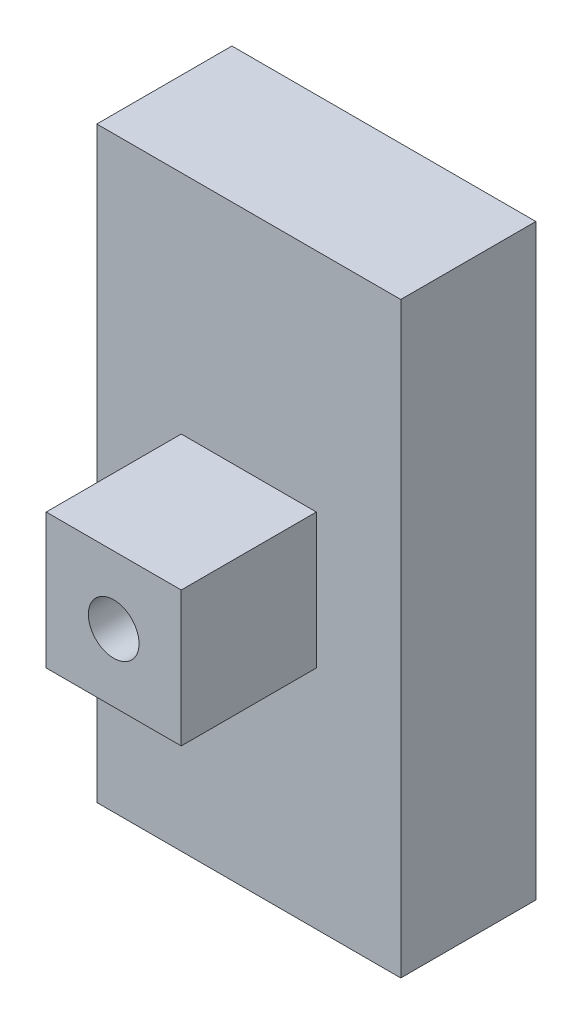
ISO-10303-21;
HEADER;
FILE_DESCRIPTION(('STEP AP214'),'2;1');
FILE_NAME('part.step','',(''),(''),'','','');
FILE_SCHEMA(('AUTOMOTIVE_DESIGN { 1 0 10303 214 1 1 1 1 }'));
ENDSEC;
DATA;
#1=APPLICATION_CONTEXT('core data for automotive mechanical design processes');
#2=APPLICATION_PROTOCOL_DEFINITION('international standard','automotive_design',2000,#1);
#3=PRODUCT_CONTEXT('',#1,'mechanical');
#4=PRODUCT('Part','Part','',(#3));
#5=PRODUCT_RELATED_PRODUCT_CATEGORY('part','',(#4));
#6=PRODUCT_DEFINITION_FORMATION('','',#4);
#7=PRODUCT_DEFINITION_CONTEXT('part definition',#1,'design');
#8=PRODUCT_DEFINITION('design','',#6,#7);
#9=PRODUCT_DEFINITION_SHAPE('','',#8);
#10=(LENGTH_UNIT() NAMED_UNIT(*) SI_UNIT(.MILLI.,.METRE.));
#11=(NAMED_UNIT(*) PLANE_ANGLE_UNIT() SI_UNIT($,.RADIAN.));
#12=(NAMED_UNIT(*) SI_UNIT($,.STERADIAN.) SOLID_ANGLE_UNIT());
#13=UNCERTAINTY_MEASURE_WITH_UNIT(LENGTH_MEASURE(1.E-05),#10,'distance_accuracy_value','');
#14=(GEOMETRIC_REPRESENTATION_CONTEXT(3) GLOBAL_UNCERTAINTY_ASSIGNED_CONTEXT((#13)) GLOBAL_UNIT_ASSIGNED_CONTEXT((#10,
#11,#12)) REPRESENTATION_CONTEXT('',''));
#15=CARTESIAN_POINT('',(0.,0.,0.));
#16=DIRECTION('',(0.,0.,1.));
#17=DIRECTION('',(1.,0.,0.));
#18=AXIS2_PLACEMENT_3D('',#15,#16,#17);
#19=CARTESIAN_POINT('',(-45.0000000000003,86.9999999999998,40.));
#20=DIRECTION('',(0.,-1.,0.));
#21=DIRECTION('',(1.,0.,0.));
#22=AXIS2_PLACEMENT_3D('',#19,#20,#21);
#23=PLANE('',#22);
#24=DIRECTION('',(-1.,0.,0.));
#25=VECTOR('',#24,1.);
#26=CARTESIAN_POINT('',(-45.0000000000003,86.9999999999998,0.));
#27=LINE('',#26,#25);
#28=CARTESIAN_POINT('',(44.9999999999997,87.0000000000001,0.));
#29=VERTEX_POINT('',#28);
#30=CARTESIAN_POINT('',(-45.0000000000003,86.9999999999998,0.));
#31=VERTEX_POINT('',#30);
#32=EDGE_CURVE('E123',#29,#31,#27,.T.);
#33=ORIENTED_EDGE('',*,*,#32,.T.);
#34=DIRECTION('',(0.,0.,-1.));
#35=VECTOR('',#34,1.);
#36=CARTESIAN_POINT('',(-45.0000000000003,86.9999999999998,40.));
#37=LINE('',#36,#35);
#38=CARTESIAN_POINT('',(-45.0000000000003,86.9999999999998,40.));
#39=VERTEX_POINT('',#38);
#40=EDGE_CURVE('E11',#39,#31,#37,.T.);
#41=ORIENTED_EDGE('',*,*,#40,.F.);
#42=DIRECTION('',(-1.,0.,0.));
#43=VECTOR('',#42,1.);
#44=CARTESIAN_POINT('',(-45.0000000000003,86.9999999999998,40.));
#45=LINE('',#44,#43);
#46=CARTESIAN_POINT('',(44.9999999999997,87.0000000000001,40.));
#47=VERTEX_POINT('',#46);
#48=EDGE_CURVE('E132',#47,#39,#45,.T.);
#49=ORIENTED_EDGE('',*,*,#48,.F.);
#50=DIRECTION('',(0.,0.,-1.));
#51=VECTOR('',#50,1.);
#52=CARTESIAN_POINT('',(44.9999999999997,87.0000000000001,40.));
#53=LINE('',#52,#51);
#54=EDGE_CURVE('E141',#47,#29,#53,.T.);
#55=ORIENTED_EDGE('',*,*,#54,.T.);
#56=EDGE_LOOP('',(#33,#41,#49,#55));
#57=FACE_BOUND('',#56,.T.);
#58=ADVANCED_FACE('F39',(#57),#23,.F.);
#59=CARTESIAN_POINT('',(-44.9999999999997,-87.0000000000001,40.));
#60=DIRECTION('',(1.,0.,0.));
#61=DIRECTION('',(0.,1.,0.));
#62=AXIS2_PLACEMENT_3D('',#59,#60,#61);
#63=PLANE('',#62);
#64=DIRECTION('',(0.,-1.,0.));
#65=VECTOR('',#64,1.);
#66=CARTESIAN_POINT('',(-44.9999999999997,-87.0000000000001,0.));
#67=LINE('',#66,#65);
#68=CARTESIAN_POINT('',(-44.9999999999997,-87.0000000000001,0.));
#69=VERTEX_POINT('',#68);
#70=EDGE_CURVE('E126',#31,#69,#67,.T.);
#71=ORIENTED_EDGE('',*,*,#70,.T.);
#72=DIRECTION('',(0.,0.,-1.));
#73=VECTOR('',#72,1.);
#74=CARTESIAN_POINT('',(-44.9999999999997,-87.0000000000001,40.));
#75=LINE('',#74,#73);
#76=CARTESIAN_POINT('',(-44.9999999999997,-87.0000000000001,40.));
#77=VERTEX_POINT('',#76);
#78=EDGE_CURVE('E46',#77,#69,#75,.T.);
#79=ORIENTED_EDGE('',*,*,#78,.F.);
#80=DIRECTION('',(0.,-1.,0.));
#81=VECTOR('',#80,1.);
#82=CARTESIAN_POINT('',(-44.9999999999997,-87.0000000000001,40.));
#83=LINE('',#82,#81);
#84=EDGE_CURVE('E135',#39,#77,#83,.T.);
#85=ORIENTED_EDGE('',*,*,#84,.F.);
#86=ORIENTED_EDGE('',*,*,#40,.T.);
#87=EDGE_LOOP('',(#71,#79,#85,#86));
#88=FACE_BOUND('',#87,.T.);
#89=ADVANCED_FACE('F172',(#88),#63,.F.);
#90=CARTESIAN_POINT('',(-44.9999999999997,-87.0000000000001,40.));
#91=DIRECTION('',(0.,1.,0.));
#92=DIRECTION('',(-1.,0.,0.));
#93=AXIS2_PLACEMENT_3D('',#90,#91,#92);
#94=PLANE('',#93);
#95=DIRECTION('',(1.,0.,0.));
#96=VECTOR('',#95,1.);
#97=CARTESIAN_POINT('',(-44.9999999999997,-87.0000000000001,0.));
#98=LINE('',#97,#96);
#99=CARTESIAN_POINT('',(45.0000000000003,-86.9999999999998,0.));
#100=VERTEX_POINT('',#99);
#101=EDGE_CURVE('E144',#69,#100,#98,.T.);
#102=ORIENTED_EDGE('',*,*,#101,.T.);
#103=DIRECTION('',(0.,0.,-1.));
#104=VECTOR('',#103,1.);
#105=CARTESIAN_POINT('',(45.0000000000003,-86.9999999999998,40.));
#106=LINE('',#105,#104);
#107=CARTESIAN_POINT('',(45.0000000000003,-86.9999999999998,40.));
#108=VERTEX_POINT('',#107);
#109=EDGE_CURVE('E149',#108,#100,#106,.T.);
#110=ORIENTED_EDGE('',*,*,#109,.F.);
#111=DIRECTION('',(1.,0.,0.));
#112=VECTOR('',#111,1.);
#113=CARTESIAN_POINT('',(-44.9999999999997,-87.0000000000001,40.));
#114=LINE('',#113,#112);
#115=EDGE_CURVE('E138',#77,#108,#114,.T.);
#116=ORIENTED_EDGE('',*,*,#115,.F.);
#117=ORIENTED_EDGE('',*,*,#78,.T.);
#118=EDGE_LOOP('',(#102,#110,#116,#117));
#119=FACE_BOUND('',#118,.T.);
#120=ADVANCED_FACE('F156',(#119),#94,.F.);
#121=CARTESIAN_POINT('',(45.0000000000003,-86.9999999999998,40.));
#122=DIRECTION('',(-1.,0.,0.));
#123=DIRECTION('',(0.,-1.,0.));
#124=AXIS2_PLACEMENT_3D('',#121,#122,#123);
#125=PLANE('',#124);
#126=DIRECTION('',(0.,1.,0.));
#127=VECTOR('',#126,1.);
#128=CARTESIAN_POINT('',(45.0000000000003,-86.9999999999998,0.));
#129=LINE('',#128,#127);
#130=EDGE_CURVE('E136',#100,#29,#129,.T.);
#131=ORIENTED_EDGE('',*,*,#130,.T.);
#132=ORIENTED_EDGE('',*,*,#54,.F.);
#133=DIRECTION('',(0.,1.,0.));
#134=VECTOR('',#133,1.);
#135=CARTESIAN_POINT('',(45.0000000000003,-86.9999999999998,40.));
#136=LINE('',#135,#134);
#137=EDGE_CURVE('E140',#108,#47,#136,.T.);
#138=ORIENTED_EDGE('',*,*,#137,.F.);
#139=ORIENTED_EDGE('',*,*,#109,.T.);
#140=EDGE_LOOP('',(#131,#132,#138,#139));
#141=FACE_BOUND('',#140,.T.);
#142=ADVANCED_FACE('F165',(#141),#125,.F.);
#143=CARTESIAN_POINT('',(0.,0.,40.));
#144=DIRECTION('',(0.,0.,1.));
#145=DIRECTION('',(1.,0.,0.));
#146=AXIS2_PLACEMENT_3D('',#143,#144,#145);
#147=PLANE('',#146);
#148=DIRECTION('',(0.,1.,0.));
#149=VECTOR('',#148,1.);
#150=CARTESIAN_POINT('',(20.,20.,40.));
#151=LINE('',#150,#149);
#152=CARTESIAN_POINT('',(20.,-20.,40.));
#153=VERTEX_POINT('',#152);
#154=CARTESIAN_POINT('',(20.,20.,40.));
#155=VERTEX_POINT('',#154);
#156=EDGE_CURVE('E53',#153,#155,#151,.T.);
#157=ORIENTED_EDGE('',*,*,#156,.F.);
#158=DIRECTION('',(1.,0.,0.));
#159=VECTOR('',#158,1.);
#160=CARTESIAN_POINT('',(-20.,-20.,40.));
#161=LINE('',#160,#159);
#162=CARTESIAN_POINT('',(-20.,-20.,40.));
#163=VERTEX_POINT('',#162);
#164=EDGE_CURVE('E57',#163,#153,#161,.T.);
#165=ORIENTED_EDGE('',*,*,#164,.F.);
#166=DIRECTION('',(0.,-1.,0.));
#167=VECTOR('',#166,1.);
#168=CARTESIAN_POINT('',(-20.,20.,40.));
#169=LINE('',#168,#167);
#170=CARTESIAN_POINT('',(-20.,20.,40.));
#171=VERTEX_POINT('',#170);
#172=EDGE_CURVE('E224',#171,#163,#169,.T.);
#173=ORIENTED_EDGE('',*,*,#172,.F.);
#174=DIRECTION('',(-1.,0.,0.));
#175=VECTOR('',#174,1.);
#176=CARTESIAN_POINT('',(-20.,20.,40.));
#177=LINE('',#176,#175);
#178=EDGE_CURVE('E215',#155,#171,#177,.T.);
#179=ORIENTED_EDGE('',*,*,#178,.F.);
#180=EDGE_LOOP('',(#157,#165,#173,#179));
#181=FACE_BOUND('',#180,.T.);
#182=ORIENTED_EDGE('',*,*,#48,.T.);
#183=ORIENTED_EDGE('',*,*,#84,.T.);
#184=ORIENTED_EDGE('',*,*,#115,.T.);
#185=ORIENTED_EDGE('',*,*,#137,.T.);
#186=EDGE_LOOP('',(#182,#183,#184,#185));
#187=FACE_BOUND('',#186,.T.);
#188=ADVANCED_FACE('F171',(#181,#187),#147,.T.);
#189=CARTESIAN_POINT('',(0.,0.,0.));
#190=DIRECTION('',(0.,0.,1.));
#191=DIRECTION('',(1.,0.,0.));
#192=AXIS2_PLACEMENT_3D('',#189,#190,#191);
#193=PLANE('',#192);
#194=ORIENTED_EDGE('',*,*,#32,.F.);
#195=ORIENTED_EDGE('',*,*,#130,.F.);
#196=ORIENTED_EDGE('',*,*,#101,.F.);
#197=ORIENTED_EDGE('',*,*,#70,.F.);
#198=EDGE_LOOP('',(#194,#195,#196,#197));
#199=FACE_BOUND('',#198,.T.);
#200=ADVANCED_FACE('F162',(#199),#193,.F.);
#201=CARTESIAN_POINT('',(20.,20.,80.));
#202=DIRECTION('',(-1.,0.,0.));
#203=DIRECTION('',(0.,-1.,0.));
#204=AXIS2_PLACEMENT_3D('',#201,#202,#203);
#205=PLANE('',#204);
#206=ORIENTED_EDGE('',*,*,#156,.T.);
#207=DIRECTION('',(0.,0.,-1.));
#208=VECTOR('',#207,1.);
#209=CARTESIAN_POINT('',(20.,20.,80.));
#210=LINE('',#209,#208);
#211=CARTESIAN_POINT('',(20.,20.,80.));
#212=VERTEX_POINT('',#211);
#213=EDGE_CURVE('E106',#212,#155,#210,.T.);
#214=ORIENTED_EDGE('',*,*,#213,.F.);
#215=DIRECTION('',(0.,1.,0.));
#216=VECTOR('',#215,1.);
#217=CARTESIAN_POINT('',(20.,20.,80.));
#218=LINE('',#217,#216);
#219=CARTESIAN_POINT('',(20.,-20.,80.));
#220=VERTEX_POINT('',#219);
#221=EDGE_CURVE('E112',#220,#212,#218,.T.);
#222=ORIENTED_EDGE('',*,*,#221,.F.);
#223=DIRECTION('',(0.,0.,-1.));
#224=VECTOR('',#223,1.);
#225=CARTESIAN_POINT('',(20.,-20.,80.));
#226=LINE('',#225,#224);
#227=EDGE_CURVE('E221',#220,#153,#226,.T.);
#228=ORIENTED_EDGE('',*,*,#227,.T.);
#229=EDGE_LOOP('',(#206,#214,#222,#228));
#230=FACE_BOUND('',#229,.T.);
#231=ADVANCED_FACE('F122',(#230),#205,.F.);
#232=CARTESIAN_POINT('',(-20.,20.,80.));
#233=DIRECTION('',(0.,-1.,0.));
#234=DIRECTION('',(0.,0.,-1.));
#235=AXIS2_PLACEMENT_3D('',#232,#233,#234);
#236=PLANE('',#235);
#237=ORIENTED_EDGE('',*,*,#178,.T.);
#238=DIRECTION('',(0.,0.,-1.));
#239=VECTOR('',#238,1.);
#240=CARTESIAN_POINT('',(-20.,20.,80.));
#241=LINE('',#240,#239);
#242=CARTESIAN_POINT('',(-20.,20.,80.));
#243=VERTEX_POINT('',#242);
#244=EDGE_CURVE('E108',#243,#171,#241,.T.);
#245=ORIENTED_EDGE('',*,*,#244,.F.);
#246=DIRECTION('',(-1.,0.,0.));
#247=VECTOR('',#246,1.);
#248=CARTESIAN_POINT('',(-20.,20.,80.));
#249=LINE('',#248,#247);
#250=EDGE_CURVE('E101',#212,#243,#249,.T.);
#251=ORIENTED_EDGE('',*,*,#250,.F.);
#252=ORIENTED_EDGE('',*,*,#213,.T.);
#253=EDGE_LOOP('',(#237,#245,#251,#252));
#254=FACE_BOUND('',#253,.T.);
#255=ADVANCED_FACE('F104',(#254),#236,.F.);
#256=CARTESIAN_POINT('',(-20.,20.,80.));
#257=DIRECTION('',(1.,0.,0.));
#258=DIRECTION('',(0.,1.,0.));
#259=AXIS2_PLACEMENT_3D('',#256,#257,#258);
#260=PLANE('',#259);
#261=ORIENTED_EDGE('',*,*,#172,.T.);
#262=DIRECTION('',(0.,0.,-1.));
#263=VECTOR('',#262,1.);
#264=CARTESIAN_POINT('',(-20.,-20.,80.));
#265=LINE('',#264,#263);
#266=CARTESIAN_POINT('',(-20.,-20.,80.));
#267=VERTEX_POINT('',#266);
#268=EDGE_CURVE('E128',#267,#163,#265,.T.);
#269=ORIENTED_EDGE('',*,*,#268,.F.);
#270=DIRECTION('',(0.,-1.,0.));
#271=VECTOR('',#270,1.);
#272=CARTESIAN_POINT('',(-20.,20.,80.));
#273=LINE('',#272,#271);
#274=EDGE_CURVE('E111',#243,#267,#273,.T.);
#275=ORIENTED_EDGE('',*,*,#274,.F.);
#276=ORIENTED_EDGE('',*,*,#244,.T.);
#277=EDGE_LOOP('',(#261,#269,#275,#276));
#278=FACE_BOUND('',#277,.T.);
#279=ADVANCED_FACE('F190',(#278),#260,.F.);
#280=CARTESIAN_POINT('',(-20.,-20.,80.));
#281=DIRECTION('',(0.,1.,0.));
#282=DIRECTION('',(0.,0.,1.));
#283=AXIS2_PLACEMENT_3D('',#280,#281,#282);
#284=PLANE('',#283);
#285=ORIENTED_EDGE('',*,*,#164,.T.);
#286=ORIENTED_EDGE('',*,*,#227,.F.);
#287=DIRECTION('',(1.,0.,0.));
#288=VECTOR('',#287,1.);
#289=CARTESIAN_POINT('',(-20.,-20.,80.));
#290=LINE('',#289,#288);
#291=EDGE_CURVE('E117',#267,#220,#290,.T.);
#292=ORIENTED_EDGE('',*,*,#291,.F.);
#293=ORIENTED_EDGE('',*,*,#268,.T.);
#294=EDGE_LOOP('',(#285,#286,#292,#293));
#295=FACE_BOUND('',#294,.T.);
#296=ADVANCED_FACE('F193',(#295),#284,.F.);
#297=CARTESIAN_POINT('',(0.,0.,80.));
#298=DIRECTION('',(0.,0.,1.));
#299=DIRECTION('',(1.,0.,0.));
#300=AXIS2_PLACEMENT_3D('',#297,#298,#299);
#301=PLANE('',#300);
#302=CARTESIAN_POINT('',(0.,0.,80.));
#303=DIRECTION('',(0.,0.,1.));
#304=DIRECTION('',(1.,0.,0.));
#305=AXIS2_PLACEMENT_3D('',#302,#303,#304);
#306=CIRCLE('',#305,7.5);
#307=CARTESIAN_POINT('',(7.5,0.,80.));
#308=VERTEX_POINT('',#307);
#309=EDGE_CURVE('E213',#308,#308,#306,.T.);
#310=ORIENTED_EDGE('',*,*,#309,.F.);
#311=EDGE_LOOP('',(#310));
#312=FACE_BOUND('',#311,.T.);
#313=ORIENTED_EDGE('',*,*,#221,.T.);
#314=ORIENTED_EDGE('',*,*,#250,.T.);
#315=ORIENTED_EDGE('',*,*,#274,.T.);
#316=ORIENTED_EDGE('',*,*,#291,.T.);
#317=EDGE_LOOP('',(#313,#314,#315,#316));
#318=FACE_BOUND('',#317,.T.);
#319=ADVANCED_FACE('F115',(#312,#318),#301,.T.);
#320=CARTESIAN_POINT('',(0.,0.,40.));
#321=DIRECTION('',(0.,0.,1.));
#322=DIRECTION('',(1.,0.,0.));
#323=AXIS2_PLACEMENT_3D('',#320,#321,#322);
#324=CYLINDRICAL_SURFACE('',#323,7.5);
#325=CARTESIAN_POINT('',(0.,0.,40.));
#326=DIRECTION('',(0.,0.,1.));
#327=DIRECTION('',(1.,0.,0.));
#328=AXIS2_PLACEMENT_3D('',#325,#326,#327);
#329=CIRCLE('',#328,7.5);
#330=CARTESIAN_POINT('',(7.5,0.,40.));
#331=VERTEX_POINT('',#330);
#332=EDGE_CURVE('E212',#331,#331,#329,.T.);
#333=ORIENTED_EDGE('',*,*,#332,.F.);
#334=EDGE_LOOP('',(#333));
#335=FACE_BOUND('',#334,.T.);
#336=ORIENTED_EDGE('',*,*,#309,.T.);
#337=EDGE_LOOP('',(#336));
#338=FACE_BOUND('',#337,.T.);
#339=ADVANCED_FACE('F200',(#335,#338),#324,.F.);
#340=CARTESIAN_POINT('',(0.,0.,40.));
#341=DIRECTION('',(0.,0.,1.));
#342=DIRECTION('',(1.,0.,0.));
#343=AXIS2_PLACEMENT_3D('',#340,#341,#342);
#344=PLANE('',#343);
#345=ORIENTED_EDGE('',*,*,#332,.T.);
#346=EDGE_LOOP('',(#345));
#347=FACE_BOUND('',#346,.T.);
#348=ADVANCED_FACE('F204',(#347),#344,.T.);
#349=CLOSED_SHELL('',(#58,#89,#120,#142,#188,#200,#231,#255,#279,#296,#319,#339,#348));
#350=MANIFOLD_SOLID_BREP('B2',#349);
#351=ADVANCED_BREP_SHAPE_REPRESENTATION('',(#18,#350),#14);
#352=SHAPE_DEFINITION_REPRESENTATION(#9,#351);
ENDSEC;
END-ISO-10303-21;
